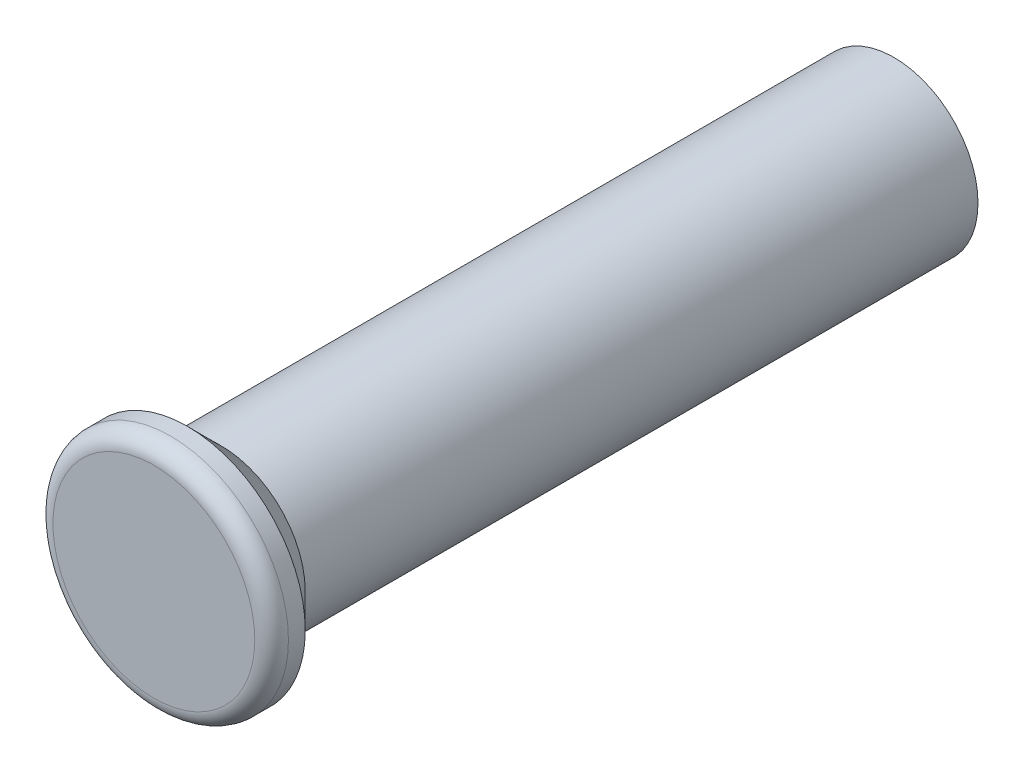
ISO-10303-21;
HEADER;
FILE_DESCRIPTION(('STEP AP214'),'2;1');
FILE_NAME('part.step','',(''),(''),'','','');
FILE_SCHEMA(('AUTOMOTIVE_DESIGN { 1 0 10303 214 1 1 1 1 }'));
ENDSEC;
DATA;
#1=APPLICATION_CONTEXT('core data for automotive mechanical design processes');
#2=APPLICATION_PROTOCOL_DEFINITION('international standard','automotive_design',2000,#1);
#3=PRODUCT_CONTEXT('',#1,'mechanical');
#4=PRODUCT('Part','Part','',(#3));
#5=PRODUCT_RELATED_PRODUCT_CATEGORY('part','',(#4));
#6=PRODUCT_DEFINITION_FORMATION('','',#4);
#7=PRODUCT_DEFINITION_CONTEXT('part definition',#1,'design');
#8=PRODUCT_DEFINITION('design','',#6,#7);
#9=PRODUCT_DEFINITION_SHAPE('','',#8);
#10=(LENGTH_UNIT() NAMED_UNIT(*) SI_UNIT(.MILLI.,.METRE.));
#11=(NAMED_UNIT(*) PLANE_ANGLE_UNIT() SI_UNIT($,.RADIAN.));
#12=(NAMED_UNIT(*) SI_UNIT($,.STERADIAN.) SOLID_ANGLE_UNIT());
#13=UNCERTAINTY_MEASURE_WITH_UNIT(LENGTH_MEASURE(1.E-05),#10,'distance_accuracy_value','');
#14=(GEOMETRIC_REPRESENTATION_CONTEXT(3) GLOBAL_UNCERTAINTY_ASSIGNED_CONTEXT((#13)) GLOBAL_UNIT_ASSIGNED_CONTEXT((#10,
#11,#12)) REPRESENTATION_CONTEXT('',''));
#15=CARTESIAN_POINT('',(0.,0.,0.));
#16=DIRECTION('',(0.,0.,1.));
#17=DIRECTION('',(1.,0.,0.));
#18=AXIS2_PLACEMENT_3D('',#15,#16,#17);
#19=CARTESIAN_POINT('',(0.,0.,-20.));
#20=DIRECTION('',(0.,0.,1.));
#21=DIRECTION('',(1.,0.,0.));
#22=AXIS2_PLACEMENT_3D('',#19,#20,#21);
#23=CYLINDRICAL_SURFACE('',#22,2.5);
#24=CARTESIAN_POINT('',(0.,0.,-20.));
#25=DIRECTION('',(0.,0.,1.));
#26=DIRECTION('',(1.,0.,0.));
#27=AXIS2_PLACEMENT_3D('',#24,#25,#26);
#28=CIRCLE('',#27,2.5);
#29=CARTESIAN_POINT('',(2.5,0.,-20.));
#30=VERTEX_POINT('',#29);
#31=EDGE_CURVE('E57',#30,#30,#28,.T.);
#32=ORIENTED_EDGE('',*,*,#31,.T.);
#33=EDGE_LOOP('',(#32));
#34=FACE_BOUND('',#33,.T.);
#35=CARTESIAN_POINT('',(0.,0.,0.));
#36=DIRECTION('',(0.,0.,1.));
#37=DIRECTION('',(1.,0.,0.));
#38=AXIS2_PLACEMENT_3D('',#35,#36,#37);
#39=CIRCLE('',#38,2.5);
#40=CARTESIAN_POINT('',(2.5,0.,0.));
#41=VERTEX_POINT('',#40);
#42=EDGE_CURVE('E56',#41,#41,#39,.T.);
#43=ORIENTED_EDGE('',*,*,#42,.F.);
#44=EDGE_LOOP('',(#43));
#45=FACE_BOUND('',#44,.T.);
#46=ADVANCED_FACE('F41',(#34,#45),#23,.T.);
#47=CARTESIAN_POINT('',(0.,0.,-20.));
#48=DIRECTION('',(0.,0.,1.));
#49=DIRECTION('',(1.,0.,0.));
#50=AXIS2_PLACEMENT_3D('',#47,#48,#49);
#51=PLANE('',#50);
#52=ORIENTED_EDGE('',*,*,#31,.F.);
#53=EDGE_LOOP('',(#52));
#54=FACE_BOUND('',#53,.T.);
#55=ADVANCED_FACE('F70',(#54),#51,.F.);
#56=CARTESIAN_POINT('',(0.,0.,2.));
#57=DIRECTION('',(0.,0.,-1.));
#58=DIRECTION('',(-1.,0.,0.));
#59=AXIS2_PLACEMENT_3D('',#56,#57,#58);
#60=CYLINDRICAL_SURFACE('',#59,3.5);
#61=CARTESIAN_POINT('',(0.,0.,1.5));
#62=DIRECTION('',(0.,0.,1.));
#63=DIRECTION('',(1.,0.,0.));
#64=AXIS2_PLACEMENT_3D('',#61,#62,#63);
#65=CIRCLE('',#64,3.5);
#66=CARTESIAN_POINT('',(3.5,0.,1.5));
#67=VERTEX_POINT('',#66);
#68=EDGE_CURVE('E10',#67,#67,#65,.F.);
#69=ORIENTED_EDGE('',*,*,#68,.T.);
#70=EDGE_LOOP('',(#69));
#71=FACE_BOUND('',#70,.T.);
#72=CARTESIAN_POINT('',(0.,0.,1.));
#73=DIRECTION('',(0.,0.,1.));
#74=DIRECTION('',(1.,0.,0.));
#75=AXIS2_PLACEMENT_3D('',#72,#73,#74);
#76=CIRCLE('',#75,3.5);
#77=CARTESIAN_POINT('',(3.5,0.,1.));
#78=VERTEX_POINT('',#77);
#79=EDGE_CURVE('E55',#78,#78,#76,.T.);
#80=ORIENTED_EDGE('',*,*,#79,.T.);
#81=EDGE_LOOP('',(#80));
#82=FACE_BOUND('',#81,.T.);
#83=ADVANCED_FACE('F69',(#71,#82),#60,.T.);
#84=CARTESIAN_POINT('',(0.,0.,2.));
#85=DIRECTION('',(0.,0.,1.));
#86=DIRECTION('',(1.,0.,0.));
#87=AXIS2_PLACEMENT_3D('',#84,#85,#86);
#88=PLANE('',#87);
#89=CARTESIAN_POINT('',(0.,0.,2.));
#90=DIRECTION('',(0.,0.,1.));
#91=DIRECTION('',(1.,0.,0.));
#92=AXIS2_PLACEMENT_3D('',#89,#90,#91);
#93=CIRCLE('',#92,3.);
#94=CARTESIAN_POINT('',(3.,0.,2.));
#95=VERTEX_POINT('',#94);
#96=EDGE_CURVE('E48',#95,#95,#93,.T.);
#97=ORIENTED_EDGE('',*,*,#96,.T.);
#98=EDGE_LOOP('',(#97));
#99=FACE_BOUND('',#98,.T.);
#100=ADVANCED_FACE('F79',(#99),#88,.T.);
#101=CARTESIAN_POINT('',(0.,0.,1.));
#102=DIRECTION('',(0.,0.,1.));
#103=DIRECTION('',(1.,0.,0.));
#104=AXIS2_PLACEMENT_3D('',#101,#102,#103);
#105=CONICAL_SURFACE('',#104,3.5,0.78539816339745);
#106=ORIENTED_EDGE('',*,*,#42,.T.);
#107=EDGE_LOOP('',(#106));
#108=FACE_BOUND('',#107,.T.);
#109=ORIENTED_EDGE('',*,*,#79,.F.);
#110=EDGE_LOOP('',(#109));
#111=FACE_BOUND('',#110,.T.);
#112=ADVANCED_FACE('F83',(#108,#111),#105,.T.);
#113=CARTESIAN_POINT('',(0.,0.,1.5));
#114=DIRECTION('',(0.,0.,1.));
#115=DIRECTION('',(1.,0.,0.));
#116=AXIS2_PLACEMENT_3D('',#113,#114,#115);
#117=TOROIDAL_SURFACE('',#116,3.,0.5);
#118=ORIENTED_EDGE('',*,*,#68,.F.);
#119=EDGE_LOOP('',(#118));
#120=FACE_BOUND('',#119,.T.);
#121=ORIENTED_EDGE('',*,*,#96,.F.);
#122=EDGE_LOOP('',(#121));
#123=FACE_BOUND('',#122,.T.);
#124=ADVANCED_FACE('F43',(#120,#123),#117,.T.);
#125=CLOSED_SHELL('',(#46,#55,#83,#100,#112,#124));
#126=MANIFOLD_SOLID_BREP('B2',#125);
#127=ADVANCED_BREP_SHAPE_REPRESENTATION('',(#18,#126),#14);
#128=SHAPE_DEFINITION_REPRESENTATION(#9,#127);
ENDSEC;
END-ISO-10303-21;
